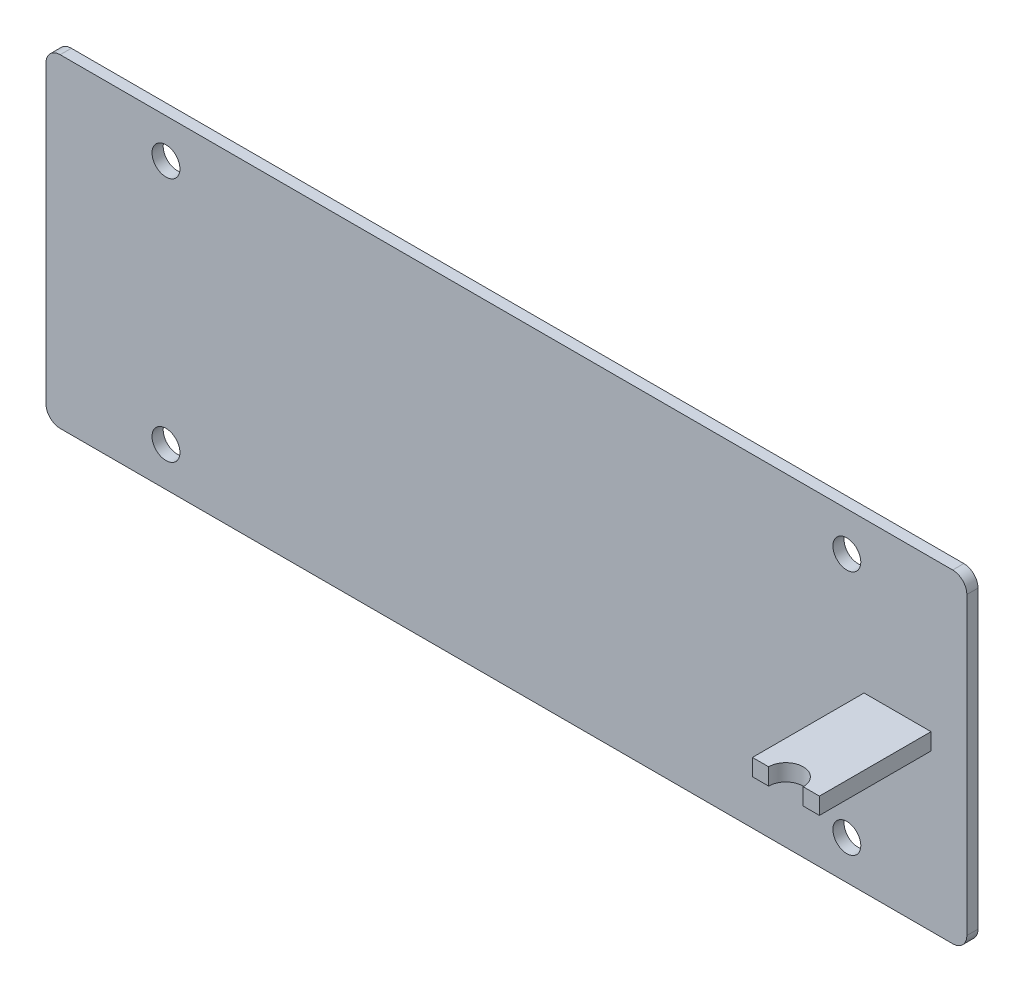
ISO-10303-21;
HEADER;
FILE_DESCRIPTION(('STEP AP214'),'2;1');
FILE_NAME('part.step','',(''),(''),'','','');
FILE_SCHEMA(('AUTOMOTIVE_DESIGN { 1 0 10303 214 1 1 1 1 }'));
ENDSEC;
DATA;
#1=APPLICATION_CONTEXT('core data for automotive mechanical design processes');
#2=APPLICATION_PROTOCOL_DEFINITION('international standard','automotive_design',2000,#1);
#3=PRODUCT_CONTEXT('',#1,'mechanical');
#4=PRODUCT('Part','Part','',(#3));
#5=PRODUCT_RELATED_PRODUCT_CATEGORY('part','',(#4));
#6=PRODUCT_DEFINITION_FORMATION('','',#4);
#7=PRODUCT_DEFINITION_CONTEXT('part definition',#1,'design');
#8=PRODUCT_DEFINITION('design','',#6,#7);
#9=PRODUCT_DEFINITION_SHAPE('','',#8);
#10=(LENGTH_UNIT() NAMED_UNIT(*) SI_UNIT(.MILLI.,.METRE.));
#11=(NAMED_UNIT(*) PLANE_ANGLE_UNIT() SI_UNIT($,.RADIAN.));
#12=(NAMED_UNIT(*) SI_UNIT($,.STERADIAN.) SOLID_ANGLE_UNIT());
#13=UNCERTAINTY_MEASURE_WITH_UNIT(LENGTH_MEASURE(1.E-05),#10,'distance_accuracy_value','');
#14=(GEOMETRIC_REPRESENTATION_CONTEXT(3) GLOBAL_UNCERTAINTY_ASSIGNED_CONTEXT((#13)) GLOBAL_UNIT_ASSIGNED_CONTEXT((#10,
#11,#12)) REPRESENTATION_CONTEXT('',''));
#15=CARTESIAN_POINT('',(0.,0.,0.));
#16=DIRECTION('',(0.,0.,1.));
#17=DIRECTION('',(1.,0.,0.));
#18=AXIS2_PLACEMENT_3D('',#15,#16,#17);
#19=CARTESIAN_POINT('',(83.313547284729,15.486887191261,11.));
#20=DIRECTION('',(0.,0.,-1.));
#21=DIRECTION('',(-1.,0.,0.));
#22=AXIS2_PLACEMENT_3D('',#19,#20,#21);
#23=PLANE('',#22);
#24=DIRECTION('',(0.,1.,0.));
#25=VECTOR('',#24,1.);
#26=CARTESIAN_POINT('',(79.2920621406611,15.486887191261,11.));
#27=LINE('',#26,#25);
#28=CARTESIAN_POINT('',(79.2920621406611,15.486887191261,11.));
#29=VERTEX_POINT('',#28);
#30=CARTESIAN_POINT('',(79.2920621406611,13.986887191261,11.));
#31=VERTEX_POINT('',#30);
#32=EDGE_CURVE('E107',#29,#31,#27,.F.);
#33=ORIENTED_EDGE('',*,*,#32,.F.);
#34=DIRECTION('',(1.,0.,0.));
#35=VECTOR('',#34,1.);
#36=CARTESIAN_POINT('',(73.2920621406611,15.486887191261,11.));
#37=LINE('',#36,#35);
#38=CARTESIAN_POINT('',(77.842062140661,15.486887191261,11.));
#39=VERTEX_POINT('',#38);
#40=EDGE_CURVE('E115',#39,#29,#37,.T.);
#41=ORIENTED_EDGE('',*,*,#40,.F.);
#42=DIRECTION('',(0.,-1.,0.));
#43=VECTOR('',#42,1.);
#44=CARTESIAN_POINT('',(77.842062140661,15.486887191261,11.));
#45=LINE('',#44,#43);
#46=CARTESIAN_POINT('',(77.842062140661,13.986887191261,11.));
#47=VERTEX_POINT('',#46);
#48=EDGE_CURVE('E245',#39,#47,#45,.T.);
#49=ORIENTED_EDGE('',*,*,#48,.T.);
#50=DIRECTION('',(1.,0.,0.));
#51=VECTOR('',#50,1.);
#52=CARTESIAN_POINT('',(79.2920621406611,13.986887191261,11.));
#53=LINE('',#52,#51);
#54=EDGE_CURVE('E98',#31,#47,#53,.F.);
#55=ORIENTED_EDGE('',*,*,#54,.F.);
#56=EDGE_LOOP('',(#33,#41,#49,#55));
#57=FACE_BOUND('',#56,.T.);
#58=ADVANCED_FACE('F16',(#57),#23,.F.);
#59=CARTESIAN_POINT('',(79.2920621406611,15.486887191261,1.));
#60=DIRECTION('',(1.,0.,0.));
#61=DIRECTION('',(0.,0.,-1.));
#62=AXIS2_PLACEMENT_3D('',#59,#60,#61);
#63=PLANE('',#62);
#64=DIRECTION('',(0.,1.,0.));
#65=VECTOR('',#64,1.);
#66=CARTESIAN_POINT('',(79.2920621406611,15.486887191261,1.));
#67=LINE('',#66,#65);
#68=CARTESIAN_POINT('',(79.2920621406611,13.986887191261,1.));
#69=VERTEX_POINT('',#68);
#70=CARTESIAN_POINT('',(79.2920621406611,15.486887191261,1.));
#71=VERTEX_POINT('',#70);
#72=EDGE_CURVE('E139',#69,#71,#67,.T.);
#73=ORIENTED_EDGE('',*,*,#72,.T.);
#74=DIRECTION('',(0.,0.,1.));
#75=VECTOR('',#74,1.);
#76=CARTESIAN_POINT('',(79.2920621406611,15.486887191261,1.));
#77=LINE('',#76,#75);
#78=EDGE_CURVE('E141',#29,#71,#77,.F.);
#79=ORIENTED_EDGE('',*,*,#78,.F.);
#80=ORIENTED_EDGE('',*,*,#32,.T.);
#81=DIRECTION('',(0.,0.,-1.));
#82=VECTOR('',#81,1.);
#83=CARTESIAN_POINT('',(79.2920621406611,13.986887191261,1.));
#84=LINE('',#83,#82);
#85=EDGE_CURVE('E142',#69,#31,#84,.F.);
#86=ORIENTED_EDGE('',*,*,#85,.F.);
#87=EDGE_LOOP('',(#73,#79,#80,#86));
#88=FACE_BOUND('',#87,.T.);
#89=ADVANCED_FACE('F140',(#88),#63,.T.);
#90=CARTESIAN_POINT('',(73.2920621406611,13.986887191261,1.));
#91=DIRECTION('',(-1.,0.,0.));
#92=DIRECTION('',(0.,0.,1.));
#93=AXIS2_PLACEMENT_3D('',#90,#91,#92);
#94=PLANE('',#93);
#95=DIRECTION('',(0.,1.,0.));
#96=VECTOR('',#95,1.);
#97=CARTESIAN_POINT('',(73.2920621406611,13.986887191261,1.));
#98=LINE('',#97,#96);
#99=CARTESIAN_POINT('',(73.2920621406611,15.486887191261,1.));
#100=VERTEX_POINT('',#99);
#101=CARTESIAN_POINT('',(73.2920621406611,13.986887191261,1.));
#102=VERTEX_POINT('',#101);
#103=EDGE_CURVE('E132',#100,#102,#98,.F.);
#104=ORIENTED_EDGE('',*,*,#103,.T.);
#105=DIRECTION('',(0.,0.,-1.));
#106=VECTOR('',#105,1.);
#107=CARTESIAN_POINT('',(73.2920621406611,13.986887191261,1.));
#108=LINE('',#107,#106);
#109=CARTESIAN_POINT('',(73.2920621406611,13.986887191261,11.));
#110=VERTEX_POINT('',#109);
#111=EDGE_CURVE('E168',#110,#102,#108,.T.);
#112=ORIENTED_EDGE('',*,*,#111,.F.);
#113=DIRECTION('',(0.,1.,0.));
#114=VECTOR('',#113,1.);
#115=CARTESIAN_POINT('',(73.2920621406611,15.486887191261,11.));
#116=LINE('',#115,#114);
#117=CARTESIAN_POINT('',(73.2920621406611,15.486887191261,11.));
#118=VERTEX_POINT('',#117);
#119=EDGE_CURVE('E250',#110,#118,#116,.T.);
#120=ORIENTED_EDGE('',*,*,#119,.T.);
#121=DIRECTION('',(0.,0.,1.));
#122=VECTOR('',#121,1.);
#123=CARTESIAN_POINT('',(73.2920621406611,15.486887191261,1.));
#124=LINE('',#123,#122);
#125=EDGE_CURVE('E120',#100,#118,#124,.T.);
#126=ORIENTED_EDGE('',*,*,#125,.F.);
#127=EDGE_LOOP('',(#104,#112,#120,#126));
#128=FACE_BOUND('',#127,.T.);
#129=ADVANCED_FACE('F256',(#128),#94,.T.);
#130=CARTESIAN_POINT('',(83.313547284729,15.486887191261,11.));
#131=DIRECTION('',(0.,0.,-1.));
#132=DIRECTION('',(-1.,0.,0.));
#133=AXIS2_PLACEMENT_3D('',#130,#131,#132);
#134=PLANE('',#133);
#135=DIRECTION('',(0.,-1.,0.));
#136=VECTOR('',#135,1.);
#137=CARTESIAN_POINT('',(74.742062140661,15.486887191261,11.));
#138=LINE('',#137,#136);
#139=CARTESIAN_POINT('',(74.742062140661,13.986887191261,11.));
#140=VERTEX_POINT('',#139);
#141=CARTESIAN_POINT('',(74.742062140661,15.486887191261,11.));
#142=VERTEX_POINT('',#141);
#143=EDGE_CURVE('E248',#140,#142,#138,.F.);
#144=ORIENTED_EDGE('',*,*,#143,.T.);
#145=DIRECTION('',(1.,0.,0.));
#146=VECTOR('',#145,1.);
#147=CARTESIAN_POINT('',(73.2920621406611,15.486887191261,11.));
#148=LINE('',#147,#146);
#149=EDGE_CURVE('E226',#118,#142,#148,.T.);
#150=ORIENTED_EDGE('',*,*,#149,.F.);
#151=ORIENTED_EDGE('',*,*,#119,.F.);
#152=DIRECTION('',(1.,0.,0.));
#153=VECTOR('',#152,1.);
#154=CARTESIAN_POINT('',(79.2920621406611,13.986887191261,11.));
#155=LINE('',#154,#153);
#156=EDGE_CURVE('E170',#140,#110,#155,.F.);
#157=ORIENTED_EDGE('',*,*,#156,.F.);
#158=EDGE_LOOP('',(#144,#150,#151,#157));
#159=FACE_BOUND('',#158,.T.);
#160=ADVANCED_FACE('F259',(#159),#134,.F.);
#161=CARTESIAN_POINT('',(76.292062140661,15.486887191261,11.));
#162=DIRECTION('',(0.,-1.,0.));
#163=DIRECTION('',(0.,0.,-1.));
#164=AXIS2_PLACEMENT_3D('',#161,#162,#163);
#165=CYLINDRICAL_SURFACE('',#164,1.55);
#166=ORIENTED_EDGE('',*,*,#48,.F.);
#167=CARTESIAN_POINT('',(76.292062140661,15.486887191261,11.));
#168=DIRECTION('',(0.,-1.,0.));
#169=DIRECTION('',(0.,0.,-1.));
#170=AXIS2_PLACEMENT_3D('',#167,#168,#169);
#171=CIRCLE('',#170,1.55);
#172=EDGE_CURVE('E155',#142,#39,#171,.T.);
#173=ORIENTED_EDGE('',*,*,#172,.F.);
#174=ORIENTED_EDGE('',*,*,#143,.F.);
#175=CARTESIAN_POINT('',(76.292062140661,13.986887191261,11.));
#176=DIRECTION('',(0.,-1.,0.));
#177=DIRECTION('',(0.,0.,-1.));
#178=AXIS2_PLACEMENT_3D('',#175,#176,#177);
#179=CIRCLE('',#178,1.55);
#180=EDGE_CURVE('E19',#47,#140,#179,.F.);
#181=ORIENTED_EDGE('',*,*,#180,.F.);
#182=EDGE_LOOP('',(#166,#173,#174,#181));
#183=FACE_BOUND('',#182,.T.);
#184=ADVANCED_FACE('F262',(#183),#165,.F.);
#185=CARTESIAN_POINT('',(79.2920621406611,13.986887191261,1.));
#186=DIRECTION('',(0.,-1.,0.));
#187=DIRECTION('',(0.,0.,-1.));
#188=AXIS2_PLACEMENT_3D('',#185,#186,#187);
#189=PLANE('',#188);
#190=DIRECTION('',(1.,0.,0.));
#191=VECTOR('',#190,1.);
#192=CARTESIAN_POINT('',(41.25,13.986887191261,1.));
#193=LINE('',#192,#191);
#194=EDGE_CURVE('E151',#69,#102,#193,.F.);
#195=ORIENTED_EDGE('',*,*,#194,.F.);
#196=ORIENTED_EDGE('',*,*,#85,.T.);
#197=ORIENTED_EDGE('',*,*,#54,.T.);
#198=ORIENTED_EDGE('',*,*,#180,.T.);
#199=ORIENTED_EDGE('',*,*,#156,.T.);
#200=ORIENTED_EDGE('',*,*,#111,.T.);
#201=EDGE_LOOP('',(#195,#196,#197,#198,#199,#200));
#202=FACE_BOUND('',#201,.T.);
#203=ADVANCED_FACE('F330',(#202),#189,.T.);
#204=CARTESIAN_POINT('',(73.2920621406611,15.486887191261,1.));
#205=DIRECTION('',(0.,1.,0.));
#206=DIRECTION('',(0.,0.,1.));
#207=AXIS2_PLACEMENT_3D('',#204,#205,#206);
#208=PLANE('',#207);
#209=ORIENTED_EDGE('',*,*,#149,.T.);
#210=ORIENTED_EDGE('',*,*,#172,.T.);
#211=ORIENTED_EDGE('',*,*,#40,.T.);
#212=ORIENTED_EDGE('',*,*,#78,.T.);
#213=DIRECTION('',(1.,0.,0.));
#214=VECTOR('',#213,1.);
#215=CARTESIAN_POINT('',(41.25,15.486887191261,1.));
#216=LINE('',#215,#214);
#217=EDGE_CURVE('E146',#100,#71,#216,.T.);
#218=ORIENTED_EDGE('',*,*,#217,.F.);
#219=ORIENTED_EDGE('',*,*,#125,.T.);
#220=EDGE_LOOP('',(#209,#210,#211,#212,#218,#219));
#221=FACE_BOUND('',#220,.T.);
#222=ADVANCED_FACE('F145',(#221),#208,.T.);
#223=CARTESIAN_POINT('',(41.25,14.5,1.));
#224=DIRECTION('',(0.,0.,1.));
#225=DIRECTION('',(1.,0.,0.));
#226=AXIS2_PLACEMENT_3D('',#223,#224,#225);
#227=PLANE('',#226);
#228=CARTESIAN_POINT('',(10.75,3.5,1.));
#229=DIRECTION('',(0.,0.,1.));
#230=DIRECTION('',(1.,0.,0.));
#231=AXIS2_PLACEMENT_3D('',#228,#229,#230);
#232=CIRCLE('',#231,1.25);
#233=CARTESIAN_POINT('',(12.,3.5,1.));
#234=VERTEX_POINT('',#233);
#235=EDGE_CURVE('E202',#234,#234,#232,.F.);
#236=ORIENTED_EDGE('',*,*,#235,.T.);
#237=EDGE_LOOP('',(#236));
#238=FACE_BOUND('',#237,.T.);
#239=CARTESIAN_POINT('',(10.75,25.5,1.));
#240=DIRECTION('',(0.,0.,1.));
#241=DIRECTION('',(1.,0.,0.));
#242=AXIS2_PLACEMENT_3D('',#239,#240,#241);
#243=CIRCLE('',#242,1.25);
#244=CARTESIAN_POINT('',(12.,25.5,1.));
#245=VERTEX_POINT('',#244);
#246=EDGE_CURVE('E205',#245,#245,#243,.F.);
#247=ORIENTED_EDGE('',*,*,#246,.T.);
#248=EDGE_LOOP('',(#247));
#249=FACE_BOUND('',#248,.T.);
#250=CARTESIAN_POINT('',(71.75,3.5,1.));
#251=DIRECTION('',(0.,0.,1.));
#252=DIRECTION('',(1.,0.,0.));
#253=AXIS2_PLACEMENT_3D('',#250,#251,#252);
#254=CIRCLE('',#253,1.25);
#255=CARTESIAN_POINT('',(73.,3.5,1.));
#256=VERTEX_POINT('',#255);
#257=EDGE_CURVE('E208',#256,#256,#254,.F.);
#258=ORIENTED_EDGE('',*,*,#257,.T.);
#259=EDGE_LOOP('',(#258));
#260=FACE_BOUND('',#259,.T.);
#261=CARTESIAN_POINT('',(71.75,25.5,1.));
#262=DIRECTION('',(0.,0.,1.));
#263=DIRECTION('',(1.,0.,0.));
#264=AXIS2_PLACEMENT_3D('',#261,#262,#263);
#265=CIRCLE('',#264,1.25);
#266=CARTESIAN_POINT('',(73.,25.5,1.));
#267=VERTEX_POINT('',#266);
#268=EDGE_CURVE('E211',#267,#267,#265,.F.);
#269=ORIENTED_EDGE('',*,*,#268,.T.);
#270=EDGE_LOOP('',(#269));
#271=FACE_BOUND('',#270,.T.);
#272=ORIENTED_EDGE('',*,*,#103,.F.);
#273=ORIENTED_EDGE('',*,*,#217,.T.);
#274=ORIENTED_EDGE('',*,*,#72,.F.);
#275=ORIENTED_EDGE('',*,*,#194,.T.);
#276=EDGE_LOOP('',(#272,#273,#274,#275));
#277=FACE_BOUND('',#276,.T.);
#278=CARTESIAN_POINT('',(81.23,27.73,1.));
#279=DIRECTION('',(0.,0.,1.));
#280=DIRECTION('',(1.,0.,0.));
#281=AXIS2_PLACEMENT_3D('',#278,#279,#280);
#282=CIRCLE('',#281,1.27000000000001);
#283=CARTESIAN_POINT('',(81.23,29.,1.));
#284=VERTEX_POINT('',#283);
#285=CARTESIAN_POINT('',(82.5,27.73,1.));
#286=VERTEX_POINT('',#285);
#287=EDGE_CURVE('E219',#284,#286,#282,.F.);
#288=ORIENTED_EDGE('',*,*,#287,.F.);
#289=DIRECTION('',(1.,0.,0.));
#290=VECTOR('',#289,1.);
#291=CARTESIAN_POINT('',(1.27000000000001,29.,1.));
#292=LINE('',#291,#290);
#293=CARTESIAN_POINT('',(1.27,29.,1.));
#294=VERTEX_POINT('',#293);
#295=EDGE_CURVE('E497',#294,#284,#292,.T.);
#296=ORIENTED_EDGE('',*,*,#295,.F.);
#297=CARTESIAN_POINT('',(1.27,27.73,1.));
#298=DIRECTION('',(0.,0.,1.));
#299=DIRECTION('',(1.,0.,0.));
#300=AXIS2_PLACEMENT_3D('',#297,#298,#299);
#301=CIRCLE('',#300,1.27);
#302=CARTESIAN_POINT('',(0.,27.73,1.));
#303=VERTEX_POINT('',#302);
#304=EDGE_CURVE('E215',#303,#294,#301,.F.);
#305=ORIENTED_EDGE('',*,*,#304,.F.);
#306=DIRECTION('',(0.,1.,0.));
#307=VECTOR('',#306,1.);
#308=CARTESIAN_POINT('',(0.,1.27,1.));
#309=LINE('',#308,#307);
#310=CARTESIAN_POINT('',(0.,1.27,1.));
#311=VERTEX_POINT('',#310);
#312=EDGE_CURVE('E493',#311,#303,#309,.T.);
#313=ORIENTED_EDGE('',*,*,#312,.F.);
#314=CARTESIAN_POINT('',(1.27,1.27,1.));
#315=DIRECTION('',(0.,0.,1.));
#316=DIRECTION('',(1.,0.,0.));
#317=AXIS2_PLACEMENT_3D('',#314,#315,#316);
#318=CIRCLE('',#317,1.27);
#319=CARTESIAN_POINT('',(1.27,0.,1.));
#320=VERTEX_POINT('',#319);
#321=EDGE_CURVE('E150',#320,#311,#318,.F.);
#322=ORIENTED_EDGE('',*,*,#321,.F.);
#323=DIRECTION('',(1.,0.,0.));
#324=VECTOR('',#323,1.);
#325=CARTESIAN_POINT('',(81.23,0.,1.));
#326=LINE('',#325,#324);
#327=CARTESIAN_POINT('',(81.23,0.,1.));
#328=VERTEX_POINT('',#327);
#329=EDGE_CURVE('E153',#328,#320,#326,.F.);
#330=ORIENTED_EDGE('',*,*,#329,.F.);
#331=CARTESIAN_POINT('',(81.23,1.27000000000002,1.));
#332=DIRECTION('',(0.,0.,1.));
#333=DIRECTION('',(1.,0.,0.));
#334=AXIS2_PLACEMENT_3D('',#331,#332,#333);
#335=CIRCLE('',#334,1.27000000000001);
#336=CARTESIAN_POINT('',(82.5,1.27000000000001,1.));
#337=VERTEX_POINT('',#336);
#338=EDGE_CURVE('E223',#337,#328,#335,.F.);
#339=ORIENTED_EDGE('',*,*,#338,.F.);
#340=DIRECTION('',(0.,1.,0.));
#341=VECTOR('',#340,1.);
#342=CARTESIAN_POINT('',(82.5,27.73,1.));
#343=LINE('',#342,#341);
#344=EDGE_CURVE('E500',#286,#337,#343,.F.);
#345=ORIENTED_EDGE('',*,*,#344,.F.);
#346=EDGE_LOOP('',(#288,#296,#305,#313,#322,#330,#339,#345));
#347=FACE_BOUND('',#346,.T.);
#348=ADVANCED_FACE('F148',(#238,#249,#260,#271,#277,#347),#227,.T.);
#349=CARTESIAN_POINT('',(1.27,1.27,0.));
#350=DIRECTION('',(0.,0.,1.));
#351=DIRECTION('',(1.,0.,0.));
#352=AXIS2_PLACEMENT_3D('',#349,#350,#351);
#353=CYLINDRICAL_SURFACE('',#352,1.27);
#354=CARTESIAN_POINT('',(1.27,1.27,0.));
#355=DIRECTION('',(0.,0.,1.));
#356=DIRECTION('',(1.,0.,0.));
#357=AXIS2_PLACEMENT_3D('',#354,#355,#356);
#358=CIRCLE('',#357,1.27);
#359=CARTESIAN_POINT('',(0.,1.27,0.));
#360=VERTEX_POINT('',#359);
#361=CARTESIAN_POINT('',(1.27,0.,0.));
#362=VERTEX_POINT('',#361);
#363=EDGE_CURVE('E199',#360,#362,#358,.T.);
#364=ORIENTED_EDGE('',*,*,#363,.T.);
#365=DIRECTION('',(0.,0.,-1.));
#366=VECTOR('',#365,1.);
#367=CARTESIAN_POINT('',(1.26999999999999,0.,0.));
#368=LINE('',#367,#366);
#369=EDGE_CURVE('E225',#320,#362,#368,.T.);
#370=ORIENTED_EDGE('',*,*,#369,.F.);
#371=ORIENTED_EDGE('',*,*,#321,.T.);
#372=DIRECTION('',(0.,0.,1.));
#373=VECTOR('',#372,1.);
#374=CARTESIAN_POINT('',(0.,1.27,0.));
#375=LINE('',#374,#373);
#376=EDGE_CURVE('E214',#360,#311,#375,.T.);
#377=ORIENTED_EDGE('',*,*,#376,.F.);
#378=EDGE_LOOP('',(#364,#370,#371,#377));
#379=FACE_BOUND('',#378,.T.);
#380=ADVANCED_FACE('F320',(#379),#353,.T.);
#381=CARTESIAN_POINT('',(81.23,0.,0.));
#382=DIRECTION('',(0.,-1.,0.));
#383=DIRECTION('',(0.,0.,-1.));
#384=AXIS2_PLACEMENT_3D('',#381,#382,#383);
#385=PLANE('',#384);
#386=DIRECTION('',(1.,0.,0.));
#387=VECTOR('',#386,1.);
#388=CARTESIAN_POINT('',(41.25,0.,0.));
#389=LINE('',#388,#387);
#390=CARTESIAN_POINT('',(81.23,0.,0.));
#391=VERTEX_POINT('',#390);
#392=EDGE_CURVE('E198',#362,#391,#389,.T.);
#393=ORIENTED_EDGE('',*,*,#392,.T.);
#394=DIRECTION('',(0.,0.,1.));
#395=VECTOR('',#394,1.);
#396=CARTESIAN_POINT('',(81.23,0.,0.));
#397=LINE('',#396,#395);
#398=EDGE_CURVE('E224',#328,#391,#397,.F.);
#399=ORIENTED_EDGE('',*,*,#398,.F.);
#400=ORIENTED_EDGE('',*,*,#329,.T.);
#401=ORIENTED_EDGE('',*,*,#369,.T.);
#402=EDGE_LOOP('',(#393,#399,#400,#401));
#403=FACE_BOUND('',#402,.T.);
#404=ADVANCED_FACE('F316',(#403),#385,.T.);
#405=CARTESIAN_POINT('',(81.23,1.27000000000002,0.));
#406=DIRECTION('',(0.,0.,1.));
#407=DIRECTION('',(1.,0.,0.));
#408=AXIS2_PLACEMENT_3D('',#405,#406,#407);
#409=CYLINDRICAL_SURFACE('',#408,1.27000000000001);
#410=CARTESIAN_POINT('',(81.23,1.27000000000002,0.));
#411=DIRECTION('',(0.,0.,1.));
#412=DIRECTION('',(1.,0.,0.));
#413=AXIS2_PLACEMENT_3D('',#410,#411,#412);
#414=CIRCLE('',#413,1.27000000000001);
#415=CARTESIAN_POINT('',(82.5,1.27000000000001,0.));
#416=VERTEX_POINT('',#415);
#417=EDGE_CURVE('E195',#391,#416,#414,.T.);
#418=ORIENTED_EDGE('',*,*,#417,.T.);
#419=DIRECTION('',(0.,0.,-1.));
#420=VECTOR('',#419,1.);
#421=CARTESIAN_POINT('',(82.5,1.27,0.));
#422=LINE('',#421,#420);
#423=EDGE_CURVE('E222',#337,#416,#422,.T.);
#424=ORIENTED_EDGE('',*,*,#423,.F.);
#425=ORIENTED_EDGE('',*,*,#338,.T.);
#426=ORIENTED_EDGE('',*,*,#398,.T.);
#427=EDGE_LOOP('',(#418,#424,#425,#426));
#428=FACE_BOUND('',#427,.T.);
#429=ADVANCED_FACE('F312',(#428),#409,.T.);
#430=CARTESIAN_POINT('',(82.5,27.73,0.));
#431=DIRECTION('',(1.,0.,0.));
#432=DIRECTION('',(0.,0.,-1.));
#433=AXIS2_PLACEMENT_3D('',#430,#431,#432);
#434=PLANE('',#433);
#435=DIRECTION('',(0.,1.,0.));
#436=VECTOR('',#435,1.);
#437=CARTESIAN_POINT('',(82.5,14.5,0.));
#438=LINE('',#437,#436);
#439=CARTESIAN_POINT('',(82.5,27.73,0.));
#440=VERTEX_POINT('',#439);
#441=EDGE_CURVE('E194',#416,#440,#438,.T.);
#442=ORIENTED_EDGE('',*,*,#441,.T.);
#443=DIRECTION('',(0.,0.,1.));
#444=VECTOR('',#443,1.);
#445=CARTESIAN_POINT('',(82.5,27.73,0.));
#446=LINE('',#445,#444);
#447=EDGE_CURVE('E221',#286,#440,#446,.F.);
#448=ORIENTED_EDGE('',*,*,#447,.F.);
#449=ORIENTED_EDGE('',*,*,#344,.T.);
#450=ORIENTED_EDGE('',*,*,#423,.T.);
#451=EDGE_LOOP('',(#442,#448,#449,#450));
#452=FACE_BOUND('',#451,.T.);
#453=ADVANCED_FACE('F308',(#452),#434,.T.);
#454=CARTESIAN_POINT('',(81.23,27.73,0.));
#455=DIRECTION('',(0.,0.,1.));
#456=DIRECTION('',(1.,0.,0.));
#457=AXIS2_PLACEMENT_3D('',#454,#455,#456);
#458=CYLINDRICAL_SURFACE('',#457,1.27000000000001);
#459=CARTESIAN_POINT('',(81.23,27.73,0.));
#460=DIRECTION('',(0.,0.,1.));
#461=DIRECTION('',(1.,0.,0.));
#462=AXIS2_PLACEMENT_3D('',#459,#460,#461);
#463=CIRCLE('',#462,1.27000000000001);
#464=CARTESIAN_POINT('',(81.23,29.,0.));
#465=VERTEX_POINT('',#464);
#466=EDGE_CURVE('E191',#440,#465,#463,.T.);
#467=ORIENTED_EDGE('',*,*,#466,.T.);
#468=DIRECTION('',(0.,0.,1.));
#469=VECTOR('',#468,1.);
#470=CARTESIAN_POINT('',(81.23,29.,0.));
#471=LINE('',#470,#469);
#472=EDGE_CURVE('E218',#284,#465,#471,.F.);
#473=ORIENTED_EDGE('',*,*,#472,.F.);
#474=ORIENTED_EDGE('',*,*,#287,.T.);
#475=ORIENTED_EDGE('',*,*,#447,.T.);
#476=EDGE_LOOP('',(#467,#473,#474,#475));
#477=FACE_BOUND('',#476,.T.);
#478=ADVANCED_FACE('F304',(#477),#458,.T.);
#479=CARTESIAN_POINT('',(1.27000000000001,29.,0.));
#480=DIRECTION('',(0.,1.,0.));
#481=DIRECTION('',(0.,0.,1.));
#482=AXIS2_PLACEMENT_3D('',#479,#480,#481);
#483=PLANE('',#482);
#484=DIRECTION('',(1.,0.,0.));
#485=VECTOR('',#484,1.);
#486=CARTESIAN_POINT('',(41.25,29.,0.));
#487=LINE('',#486,#485);
#488=CARTESIAN_POINT('',(1.27,29.,0.));
#489=VERTEX_POINT('',#488);
#490=EDGE_CURVE('E190',#465,#489,#487,.F.);
#491=ORIENTED_EDGE('',*,*,#490,.T.);
#492=DIRECTION('',(0.,0.,1.));
#493=VECTOR('',#492,1.);
#494=CARTESIAN_POINT('',(1.27000000000001,29.,0.));
#495=LINE('',#494,#493);
#496=EDGE_CURVE('E217',#294,#489,#495,.F.);
#497=ORIENTED_EDGE('',*,*,#496,.F.);
#498=ORIENTED_EDGE('',*,*,#295,.T.);
#499=ORIENTED_EDGE('',*,*,#472,.T.);
#500=EDGE_LOOP('',(#491,#497,#498,#499));
#501=FACE_BOUND('',#500,.T.);
#502=ADVANCED_FACE('F300',(#501),#483,.T.);
#503=CARTESIAN_POINT('',(1.27,27.73,0.));
#504=DIRECTION('',(0.,0.,1.));
#505=DIRECTION('',(1.,0.,0.));
#506=AXIS2_PLACEMENT_3D('',#503,#504,#505);
#507=CYLINDRICAL_SURFACE('',#506,1.27);
#508=CARTESIAN_POINT('',(1.27,27.73,0.));
#509=DIRECTION('',(0.,0.,1.));
#510=DIRECTION('',(1.,0.,0.));
#511=AXIS2_PLACEMENT_3D('',#508,#509,#510);
#512=CIRCLE('',#511,1.27);
#513=CARTESIAN_POINT('',(0.,27.73,0.));
#514=VERTEX_POINT('',#513);
#515=EDGE_CURVE('E187',#489,#514,#512,.T.);
#516=ORIENTED_EDGE('',*,*,#515,.T.);
#517=DIRECTION('',(0.,0.,1.));
#518=VECTOR('',#517,1.);
#519=CARTESIAN_POINT('',(0.,27.73,0.));
#520=LINE('',#519,#518);
#521=EDGE_CURVE('E34',#303,#514,#520,.F.);
#522=ORIENTED_EDGE('',*,*,#521,.F.);
#523=ORIENTED_EDGE('',*,*,#304,.T.);
#524=ORIENTED_EDGE('',*,*,#496,.T.);
#525=EDGE_LOOP('',(#516,#522,#523,#524));
#526=FACE_BOUND('',#525,.T.);
#527=ADVANCED_FACE('F297',(#526),#507,.T.);
#528=CARTESIAN_POINT('',(0.,1.27,0.));
#529=DIRECTION('',(-1.,0.,0.));
#530=DIRECTION('',(0.,0.,1.));
#531=AXIS2_PLACEMENT_3D('',#528,#529,#530);
#532=PLANE('',#531);
#533=DIRECTION('',(0.,1.,0.));
#534=VECTOR('',#533,1.);
#535=CARTESIAN_POINT('',(0.,14.5,0.));
#536=LINE('',#535,#534);
#537=EDGE_CURVE('E186',#514,#360,#536,.F.);
#538=ORIENTED_EDGE('',*,*,#537,.T.);
#539=ORIENTED_EDGE('',*,*,#376,.T.);
#540=ORIENTED_EDGE('',*,*,#312,.T.);
#541=ORIENTED_EDGE('',*,*,#521,.T.);
#542=EDGE_LOOP('',(#538,#539,#540,#541));
#543=FACE_BOUND('',#542,.T.);
#544=ADVANCED_FACE('F293',(#543),#532,.T.);
#545=CARTESIAN_POINT('',(71.75,25.5,0.));
#546=DIRECTION('',(0.,0.,1.));
#547=DIRECTION('',(1.,0.,0.));
#548=AXIS2_PLACEMENT_3D('',#545,#546,#547);
#549=CYLINDRICAL_SURFACE('',#548,1.25);
#550=CARTESIAN_POINT('',(71.75,25.5,0.));
#551=DIRECTION('',(0.,0.,1.));
#552=DIRECTION('',(1.,0.,0.));
#553=AXIS2_PLACEMENT_3D('',#550,#551,#552);
#554=CIRCLE('',#553,1.25);
#555=CARTESIAN_POINT('',(73.,25.5,0.));
#556=VERTEX_POINT('',#555);
#557=EDGE_CURVE('E183',#556,#556,#554,.F.);
#558=ORIENTED_EDGE('',*,*,#557,.T.);
#559=EDGE_LOOP('',(#558));
#560=FACE_BOUND('',#559,.T.);
#561=ORIENTED_EDGE('',*,*,#268,.F.);
#562=EDGE_LOOP('',(#561));
#563=FACE_BOUND('',#562,.T.);
#564=ADVANCED_FACE('F289',(#560,#563),#549,.F.);
#565=CARTESIAN_POINT('',(71.75,3.5,0.));
#566=DIRECTION('',(0.,0.,1.));
#567=DIRECTION('',(1.,0.,0.));
#568=AXIS2_PLACEMENT_3D('',#565,#566,#567);
#569=CYLINDRICAL_SURFACE('',#568,1.25);
#570=CARTESIAN_POINT('',(71.75,3.5,0.));
#571=DIRECTION('',(0.,0.,1.));
#572=DIRECTION('',(1.,0.,0.));
#573=AXIS2_PLACEMENT_3D('',#570,#571,#572);
#574=CIRCLE('',#573,1.25);
#575=CARTESIAN_POINT('',(73.,3.5,0.));
#576=VERTEX_POINT('',#575);
#577=EDGE_CURVE('E180',#576,#576,#574,.F.);
#578=ORIENTED_EDGE('',*,*,#577,.T.);
#579=EDGE_LOOP('',(#578));
#580=FACE_BOUND('',#579,.T.);
#581=ORIENTED_EDGE('',*,*,#257,.F.);
#582=EDGE_LOOP('',(#581));
#583=FACE_BOUND('',#582,.T.);
#584=ADVANCED_FACE('F285',(#580,#583),#569,.F.);
#585=CARTESIAN_POINT('',(10.75,25.5,0.));
#586=DIRECTION('',(0.,0.,1.));
#587=DIRECTION('',(1.,0.,0.));
#588=AXIS2_PLACEMENT_3D('',#585,#586,#587);
#589=CYLINDRICAL_SURFACE('',#588,1.25);
#590=CARTESIAN_POINT('',(10.75,25.5,0.));
#591=DIRECTION('',(0.,0.,1.));
#592=DIRECTION('',(1.,0.,0.));
#593=AXIS2_PLACEMENT_3D('',#590,#591,#592);
#594=CIRCLE('',#593,1.25);
#595=CARTESIAN_POINT('',(12.,25.5,0.));
#596=VERTEX_POINT('',#595);
#597=EDGE_CURVE('E25',#596,#596,#594,.F.);
#598=ORIENTED_EDGE('',*,*,#597,.T.);
#599=EDGE_LOOP('',(#598));
#600=FACE_BOUND('',#599,.T.);
#601=ORIENTED_EDGE('',*,*,#246,.F.);
#602=EDGE_LOOP('',(#601));
#603=FACE_BOUND('',#602,.T.);
#604=ADVANCED_FACE('F277',(#600,#603),#589,.F.);
#605=CARTESIAN_POINT('',(10.75,3.5,0.));
#606=DIRECTION('',(0.,0.,1.));
#607=DIRECTION('',(1.,0.,0.));
#608=AXIS2_PLACEMENT_3D('',#605,#606,#607);
#609=CYLINDRICAL_SURFACE('',#608,1.25);
#610=CARTESIAN_POINT('',(10.75,3.5,0.));
#611=DIRECTION('',(0.,0.,1.));
#612=DIRECTION('',(1.,0.,0.));
#613=AXIS2_PLACEMENT_3D('',#610,#611,#612);
#614=CIRCLE('',#613,1.25);
#615=CARTESIAN_POINT('',(12.,3.5,0.));
#616=VERTEX_POINT('',#615);
#617=EDGE_CURVE('E11',#616,#616,#614,.F.);
#618=ORIENTED_EDGE('',*,*,#617,.T.);
#619=EDGE_LOOP('',(#618));
#620=FACE_BOUND('',#619,.T.);
#621=ORIENTED_EDGE('',*,*,#235,.F.);
#622=EDGE_LOOP('',(#621));
#623=FACE_BOUND('',#622,.T.);
#624=ADVANCED_FACE('F271',(#620,#623),#609,.F.);
#625=CARTESIAN_POINT('',(41.25,14.5,0.));
#626=DIRECTION('',(0.,0.,1.));
#627=DIRECTION('',(1.,0.,0.));
#628=AXIS2_PLACEMENT_3D('',#625,#626,#627);
#629=PLANE('',#628);
#630=ORIENTED_EDGE('',*,*,#617,.F.);
#631=EDGE_LOOP('',(#630));
#632=FACE_BOUND('',#631,.T.);
#633=ORIENTED_EDGE('',*,*,#597,.F.);
#634=EDGE_LOOP('',(#633));
#635=FACE_BOUND('',#634,.T.);
#636=ORIENTED_EDGE('',*,*,#577,.F.);
#637=EDGE_LOOP('',(#636));
#638=FACE_BOUND('',#637,.T.);
#639=ORIENTED_EDGE('',*,*,#557,.F.);
#640=EDGE_LOOP('',(#639));
#641=FACE_BOUND('',#640,.T.);
#642=ORIENTED_EDGE('',*,*,#515,.F.);
#643=ORIENTED_EDGE('',*,*,#490,.F.);
#644=ORIENTED_EDGE('',*,*,#466,.F.);
#645=ORIENTED_EDGE('',*,*,#441,.F.);
#646=ORIENTED_EDGE('',*,*,#417,.F.);
#647=ORIENTED_EDGE('',*,*,#392,.F.);
#648=ORIENTED_EDGE('',*,*,#363,.F.);
#649=ORIENTED_EDGE('',*,*,#537,.F.);
#650=EDGE_LOOP('',(#642,#643,#644,#645,#646,#647,#648,#649));
#651=FACE_BOUND('',#650,.T.);
#652=ADVANCED_FACE('F269',(#632,#635,#638,#641,#651),#629,.F.);
#653=CLOSED_SHELL('',(#58,#89,#129,#160,#184,#203,#222,#348,#380,#404,#429,#453,#478,#502,#527,
#544,#564,#584,#604,#624,#652));
#654=MANIFOLD_SOLID_BREP('B1',#653);
#655=ADVANCED_BREP_SHAPE_REPRESENTATION('',(#18,#654),#14);
#656=SHAPE_DEFINITION_REPRESENTATION(#9,#655);
ENDSEC;
END-ISO-10303-21;
